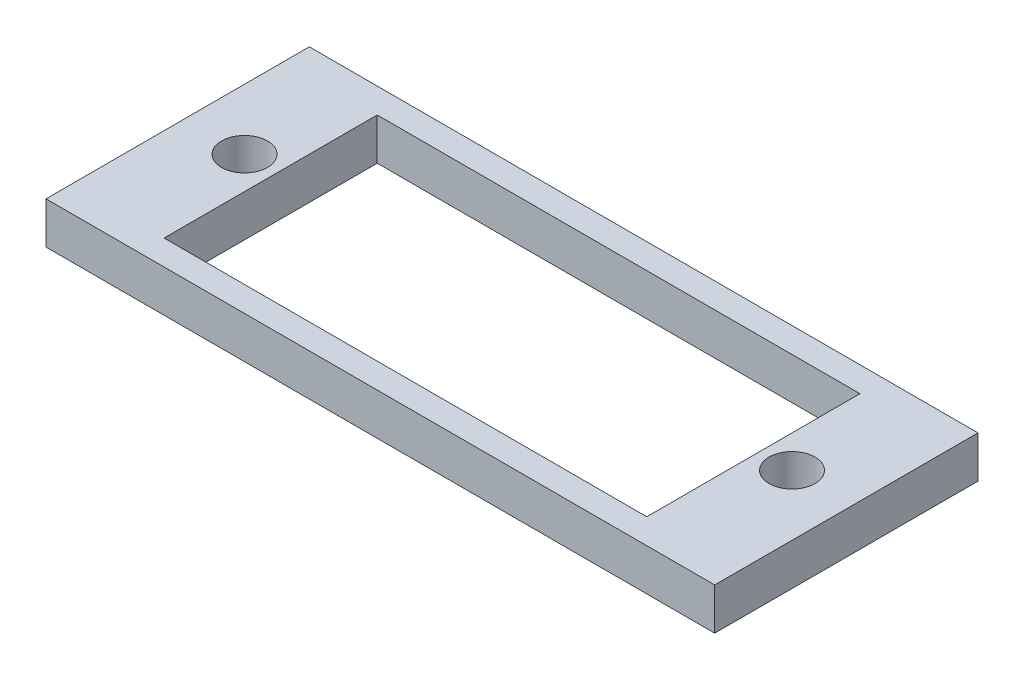
ISO-10303-21;
HEADER;
FILE_DESCRIPTION(('STEP AP214'),'2;1');
FILE_NAME('part.step','',(''),(''),'','','');
FILE_SCHEMA(('AUTOMOTIVE_DESIGN { 1 0 10303 214 1 1 1 1 }'));
ENDSEC;
DATA;
#1=APPLICATION_CONTEXT('core data for automotive mechanical design processes');
#2=APPLICATION_PROTOCOL_DEFINITION('international standard','automotive_design',2000,#1);
#3=PRODUCT_CONTEXT('',#1,'mechanical');
#4=PRODUCT('Part','Part','',(#3));
#5=PRODUCT_RELATED_PRODUCT_CATEGORY('part','',(#4));
#6=PRODUCT_DEFINITION_FORMATION('','',#4);
#7=PRODUCT_DEFINITION_CONTEXT('part definition',#1,'design');
#8=PRODUCT_DEFINITION('design','',#6,#7);
#9=PRODUCT_DEFINITION_SHAPE('','',#8);
#10=(LENGTH_UNIT() NAMED_UNIT(*) SI_UNIT(.MILLI.,.METRE.));
#11=(NAMED_UNIT(*) PLANE_ANGLE_UNIT() SI_UNIT($,.RADIAN.));
#12=(NAMED_UNIT(*) SI_UNIT($,.STERADIAN.) SOLID_ANGLE_UNIT());
#13=UNCERTAINTY_MEASURE_WITH_UNIT(LENGTH_MEASURE(1.E-05),#10,'distance_accuracy_value','');
#14=(GEOMETRIC_REPRESENTATION_CONTEXT(3) GLOBAL_UNCERTAINTY_ASSIGNED_CONTEXT((#13)) GLOBAL_UNIT_ASSIGNED_CONTEXT((#10,
#11,#12)) REPRESENTATION_CONTEXT('',''));
#15=CARTESIAN_POINT('',(0.,0.,0.));
#16=DIRECTION('',(0.,0.,1.));
#17=DIRECTION('',(1.,0.,0.));
#18=AXIS2_PLACEMENT_3D('',#15,#16,#17);
#19=CARTESIAN_POINT('',(0.,2.,0.));
#20=DIRECTION('',(0.,1.,0.));
#21=DIRECTION('',(0.,0.,1.));
#22=AXIS2_PLACEMENT_3D('',#19,#20,#21);
#23=PLANE('',#22);
#24=DIRECTION('',(1.,0.,0.));
#25=VECTOR('',#24,1.);
#26=CARTESIAN_POINT('',(4.45,2.,-1.2));
#27=LINE('',#26,#25);
#28=CARTESIAN_POINT('',(4.45,2.,-1.2));
#29=VERTEX_POINT('',#28);
#30=CARTESIAN_POINT('',(27.55,2.,-1.2));
#31=VERTEX_POINT('',#30);
#32=EDGE_CURVE('E118',#29,#31,#27,.T.);
#33=ORIENTED_EDGE('',*,*,#32,.F.);
#34=DIRECTION('',(0.,0.,1.));
#35=VECTOR('',#34,1.);
#36=CARTESIAN_POINT('',(4.45,2.,-11.4));
#37=LINE('',#36,#35);
#38=CARTESIAN_POINT('',(4.45,2.,-11.4));
#39=VERTEX_POINT('',#38);
#40=EDGE_CURVE('E109',#39,#29,#37,.T.);
#41=ORIENTED_EDGE('',*,*,#40,.F.);
#42=DIRECTION('',(-1.,0.,0.));
#43=VECTOR('',#42,1.);
#44=CARTESIAN_POINT('',(4.45,2.,-11.4));
#45=LINE('',#44,#43);
#46=CARTESIAN_POINT('',(27.55,2.,-11.4));
#47=VERTEX_POINT('',#46);
#48=EDGE_CURVE('E136',#47,#39,#45,.T.);
#49=ORIENTED_EDGE('',*,*,#48,.F.);
#50=DIRECTION('',(0.,0.,-1.));
#51=VECTOR('',#50,1.);
#52=CARTESIAN_POINT('',(27.55,2.,-11.4));
#53=LINE('',#52,#51);
#54=EDGE_CURVE('E132',#31,#47,#53,.T.);
#55=ORIENTED_EDGE('',*,*,#54,.F.);
#56=EDGE_LOOP('',(#33,#41,#49,#55));
#57=FACE_BOUND('',#56,.T.);
#58=CARTESIAN_POINT('',(29.1,2.,-6.6));
#59=DIRECTION('',(0.,1.,0.));
#60=DIRECTION('',(0.,0.,1.));
#61=AXIS2_PLACEMENT_3D('',#58,#59,#60);
#62=CIRCLE('',#61,1.1);
#63=CARTESIAN_POINT('',(29.1,2.,-5.5));
#64=VERTEX_POINT('',#63);
#65=EDGE_CURVE('E160',#64,#64,#62,.T.);
#66=ORIENTED_EDGE('',*,*,#65,.F.);
#67=EDGE_LOOP('',(#66));
#68=FACE_BOUND('',#67,.T.);
#69=DIRECTION('',(0.,0.,1.));
#70=VECTOR('',#69,1.);
#71=CARTESIAN_POINT('',(0.,2.,-12.6));
#72=LINE('',#71,#70);
#73=CARTESIAN_POINT('',(0.,2.,-12.6));
#74=VERTEX_POINT('',#73);
#75=CARTESIAN_POINT('',(0.,2.,0.));
#76=VERTEX_POINT('',#75);
#77=EDGE_CURVE('E168',#74,#76,#72,.T.);
#78=ORIENTED_EDGE('',*,*,#77,.T.);
#79=DIRECTION('',(1.,0.,0.));
#80=VECTOR('',#79,1.);
#81=CARTESIAN_POINT('',(0.,2.,0.));
#82=LINE('',#81,#80);
#83=CARTESIAN_POINT('',(32.,2.,0.));
#84=VERTEX_POINT('',#83);
#85=EDGE_CURVE('E172',#76,#84,#82,.T.);
#86=ORIENTED_EDGE('',*,*,#85,.T.);
#87=DIRECTION('',(0.,0.,-1.));
#88=VECTOR('',#87,1.);
#89=CARTESIAN_POINT('',(32.,2.,-12.6));
#90=LINE('',#89,#88);
#91=CARTESIAN_POINT('',(32.,2.,-12.6));
#92=VERTEX_POINT('',#91);
#93=EDGE_CURVE('E176',#84,#92,#90,.T.);
#94=ORIENTED_EDGE('',*,*,#93,.T.);
#95=DIRECTION('',(-1.,0.,0.));
#96=VECTOR('',#95,1.);
#97=CARTESIAN_POINT('',(0.,2.,-12.6));
#98=LINE('',#97,#96);
#99=EDGE_CURVE('E179',#92,#74,#98,.T.);
#100=ORIENTED_EDGE('',*,*,#99,.T.);
#101=EDGE_LOOP('',(#78,#86,#94,#100));
#102=FACE_BOUND('',#101,.T.);
#103=CARTESIAN_POINT('',(2.9,2.,-6.6));
#104=DIRECTION('',(0.,1.,0.));
#105=DIRECTION('',(0.,0.,1.));
#106=AXIS2_PLACEMENT_3D('',#103,#104,#105);
#107=CIRCLE('',#106,1.1);
#108=CARTESIAN_POINT('',(2.9,2.,-5.5));
#109=VERTEX_POINT('',#108);
#110=EDGE_CURVE('E144',#109,#109,#107,.T.);
#111=ORIENTED_EDGE('',*,*,#110,.F.);
#112=EDGE_LOOP('',(#111));
#113=FACE_BOUND('',#112,.T.);
#114=ADVANCED_FACE('F43',(#57,#68,#102,#113),#23,.T.);
#115=CARTESIAN_POINT('',(0.,0.,0.));
#116=DIRECTION('',(0.,1.,0.));
#117=DIRECTION('',(0.,0.,1.));
#118=AXIS2_PLACEMENT_3D('',#115,#116,#117);
#119=PLANE('',#118);
#120=CARTESIAN_POINT('',(29.1,0.,-6.6));
#121=DIRECTION('',(0.,1.,0.));
#122=DIRECTION('',(0.,0.,1.));
#123=AXIS2_PLACEMENT_3D('',#120,#121,#122);
#124=CIRCLE('',#123,1.1);
#125=CARTESIAN_POINT('',(29.1,0.,-5.5));
#126=VERTEX_POINT('',#125);
#127=EDGE_CURVE('E127',#126,#126,#124,.T.);
#128=ORIENTED_EDGE('',*,*,#127,.T.);
#129=EDGE_LOOP('',(#128));
#130=FACE_BOUND('',#129,.T.);
#131=DIRECTION('',(0.,0.,1.));
#132=VECTOR('',#131,1.);
#133=CARTESIAN_POINT('',(0.,0.,-12.6));
#134=LINE('',#133,#132);
#135=CARTESIAN_POINT('',(0.,0.,-12.6));
#136=VERTEX_POINT('',#135);
#137=CARTESIAN_POINT('',(0.,0.,0.));
#138=VERTEX_POINT('',#137);
#139=EDGE_CURVE('E164',#136,#138,#134,.T.);
#140=ORIENTED_EDGE('',*,*,#139,.F.);
#141=DIRECTION('',(-1.,0.,0.));
#142=VECTOR('',#141,1.);
#143=CARTESIAN_POINT('',(0.,0.,-12.6));
#144=LINE('',#143,#142);
#145=CARTESIAN_POINT('',(32.,0.,-12.6));
#146=VERTEX_POINT('',#145);
#147=EDGE_CURVE('E173',#146,#136,#144,.T.);
#148=ORIENTED_EDGE('',*,*,#147,.F.);
#149=DIRECTION('',(0.,0.,-1.));
#150=VECTOR('',#149,1.);
#151=CARTESIAN_POINT('',(32.,0.,-12.6));
#152=LINE('',#151,#150);
#153=CARTESIAN_POINT('',(32.,0.,0.));
#154=VERTEX_POINT('',#153);
#155=EDGE_CURVE('E189',#154,#146,#152,.T.);
#156=ORIENTED_EDGE('',*,*,#155,.F.);
#157=DIRECTION('',(1.,0.,0.));
#158=VECTOR('',#157,1.);
#159=CARTESIAN_POINT('',(0.,0.,0.));
#160=LINE('',#159,#158);
#161=EDGE_CURVE('E186',#138,#154,#160,.T.);
#162=ORIENTED_EDGE('',*,*,#161,.F.);
#163=EDGE_LOOP('',(#140,#148,#156,#162));
#164=FACE_BOUND('',#163,.T.);
#165=DIRECTION('',(0.,0.,1.));
#166=VECTOR('',#165,1.);
#167=CARTESIAN_POINT('',(4.45,0.,-11.4));
#168=LINE('',#167,#166);
#169=CARTESIAN_POINT('',(4.45,0.,-11.4));
#170=VERTEX_POINT('',#169);
#171=CARTESIAN_POINT('',(4.45,0.,-1.2));
#172=VERTEX_POINT('',#171);
#173=EDGE_CURVE('E67',#170,#172,#168,.T.);
#174=ORIENTED_EDGE('',*,*,#173,.T.);
#175=DIRECTION('',(1.,0.,0.));
#176=VECTOR('',#175,1.);
#177=CARTESIAN_POINT('',(4.45,0.,-1.2));
#178=LINE('',#177,#176);
#179=CARTESIAN_POINT('',(27.55,0.,-1.2));
#180=VERTEX_POINT('',#179);
#181=EDGE_CURVE('E125',#172,#180,#178,.T.);
#182=ORIENTED_EDGE('',*,*,#181,.T.);
#183=DIRECTION('',(0.,0.,-1.));
#184=VECTOR('',#183,1.);
#185=CARTESIAN_POINT('',(27.55,0.,-11.4));
#186=LINE('',#185,#184);
#187=CARTESIAN_POINT('',(27.55,0.,-11.4));
#188=VERTEX_POINT('',#187);
#189=EDGE_CURVE('E147',#180,#188,#186,.T.);
#190=ORIENTED_EDGE('',*,*,#189,.T.);
#191=DIRECTION('',(-1.,0.,0.));
#192=VECTOR('',#191,1.);
#193=CARTESIAN_POINT('',(4.45,0.,-11.4));
#194=LINE('',#193,#192);
#195=EDGE_CURVE('E119',#188,#170,#194,.T.);
#196=ORIENTED_EDGE('',*,*,#195,.T.);
#197=EDGE_LOOP('',(#174,#182,#190,#196));
#198=FACE_BOUND('',#197,.T.);
#199=CARTESIAN_POINT('',(2.9,0.,-6.6));
#200=DIRECTION('',(0.,1.,0.));
#201=DIRECTION('',(0.,0.,1.));
#202=AXIS2_PLACEMENT_3D('',#199,#200,#201);
#203=CIRCLE('',#202,1.1);
#204=CARTESIAN_POINT('',(2.9,0.,-5.5));
#205=VERTEX_POINT('',#204);
#206=EDGE_CURVE('E274',#205,#205,#203,.T.);
#207=ORIENTED_EDGE('',*,*,#206,.T.);
#208=EDGE_LOOP('',(#207));
#209=FACE_BOUND('',#208,.T.);
#210=ADVANCED_FACE('F212',(#130,#164,#198,#209),#119,.F.);
#211=CARTESIAN_POINT('',(0.,2.,-12.6));
#212=DIRECTION('',(1.,0.,0.));
#213=DIRECTION('',(0.,0.,-1.));
#214=AXIS2_PLACEMENT_3D('',#211,#212,#213);
#215=PLANE('',#214);
#216=ORIENTED_EDGE('',*,*,#139,.T.);
#217=DIRECTION('',(0.,-1.,0.));
#218=VECTOR('',#217,1.);
#219=CARTESIAN_POINT('',(0.,2.,0.));
#220=LINE('',#219,#218);
#221=EDGE_CURVE('E11',#76,#138,#220,.T.);
#222=ORIENTED_EDGE('',*,*,#221,.F.);
#223=ORIENTED_EDGE('',*,*,#77,.F.);
#224=DIRECTION('',(0.,-1.,0.));
#225=VECTOR('',#224,1.);
#226=CARTESIAN_POINT('',(0.,2.,-12.6));
#227=LINE('',#226,#225);
#228=EDGE_CURVE('E182',#74,#136,#227,.T.);
#229=ORIENTED_EDGE('',*,*,#228,.T.);
#230=EDGE_LOOP('',(#216,#222,#223,#229));
#231=FACE_BOUND('',#230,.T.);
#232=ADVANCED_FACE('F45',(#231),#215,.F.);
#233=CARTESIAN_POINT('',(0.,2.,0.));
#234=DIRECTION('',(0.,0.,-1.));
#235=DIRECTION('',(-1.,0.,0.));
#236=AXIS2_PLACEMENT_3D('',#233,#234,#235);
#237=PLANE('',#236);
#238=ORIENTED_EDGE('',*,*,#161,.T.);
#239=DIRECTION('',(0.,-1.,0.));
#240=VECTOR('',#239,1.);
#241=CARTESIAN_POINT('',(32.,2.,0.));
#242=LINE('',#241,#240);
#243=EDGE_CURVE('E52',#84,#154,#242,.T.);
#244=ORIENTED_EDGE('',*,*,#243,.F.);
#245=ORIENTED_EDGE('',*,*,#85,.F.);
#246=ORIENTED_EDGE('',*,*,#221,.T.);
#247=EDGE_LOOP('',(#238,#244,#245,#246));
#248=FACE_BOUND('',#247,.T.);
#249=ADVANCED_FACE('F223',(#248),#237,.F.);
#250=CARTESIAN_POINT('',(32.,2.,-12.6));
#251=DIRECTION('',(-1.,0.,0.));
#252=DIRECTION('',(0.,0.,1.));
#253=AXIS2_PLACEMENT_3D('',#250,#251,#252);
#254=PLANE('',#253);
#255=ORIENTED_EDGE('',*,*,#155,.T.);
#256=DIRECTION('',(0.,-1.,0.));
#257=VECTOR('',#256,1.);
#258=CARTESIAN_POINT('',(32.,2.,-12.6));
#259=LINE('',#258,#257);
#260=EDGE_CURVE('E197',#92,#146,#259,.T.);
#261=ORIENTED_EDGE('',*,*,#260,.F.);
#262=ORIENTED_EDGE('',*,*,#93,.F.);
#263=ORIENTED_EDGE('',*,*,#243,.T.);
#264=EDGE_LOOP('',(#255,#261,#262,#263));
#265=FACE_BOUND('',#264,.T.);
#266=ADVANCED_FACE('F206',(#265),#254,.F.);
#267=CARTESIAN_POINT('',(0.,2.,-12.6));
#268=DIRECTION('',(0.,0.,1.));
#269=DIRECTION('',(1.,0.,0.));
#270=AXIS2_PLACEMENT_3D('',#267,#268,#269);
#271=PLANE('',#270);
#272=ORIENTED_EDGE('',*,*,#147,.T.);
#273=ORIENTED_EDGE('',*,*,#228,.F.);
#274=ORIENTED_EDGE('',*,*,#99,.F.);
#275=ORIENTED_EDGE('',*,*,#260,.T.);
#276=EDGE_LOOP('',(#272,#273,#274,#275));
#277=FACE_BOUND('',#276,.T.);
#278=ADVANCED_FACE('F216',(#277),#271,.F.);
#279=CARTESIAN_POINT('',(29.1,2.,-6.6));
#280=DIRECTION('',(0.,-1.,0.));
#281=DIRECTION('',(0.,0.,-1.));
#282=AXIS2_PLACEMENT_3D('',#279,#280,#281);
#283=CYLINDRICAL_SURFACE('',#282,1.1);
#284=ORIENTED_EDGE('',*,*,#65,.T.);
#285=EDGE_LOOP('',(#284));
#286=FACE_BOUND('',#285,.T.);
#287=ORIENTED_EDGE('',*,*,#127,.F.);
#288=EDGE_LOOP('',(#287));
#289=FACE_BOUND('',#288,.T.);
#290=ADVANCED_FACE('F238',(#286,#289),#283,.F.);
#291=CARTESIAN_POINT('',(4.45,2.,-11.4));
#292=DIRECTION('',(1.,0.,0.));
#293=DIRECTION('',(0.,0.,-1.));
#294=AXIS2_PLACEMENT_3D('',#291,#292,#293);
#295=PLANE('',#294);
#296=ORIENTED_EDGE('',*,*,#173,.F.);
#297=DIRECTION('',(0.,-1.,0.));
#298=VECTOR('',#297,1.);
#299=CARTESIAN_POINT('',(4.45,2.,-11.4));
#300=LINE('',#299,#298);
#301=EDGE_CURVE('E113',#39,#170,#300,.T.);
#302=ORIENTED_EDGE('',*,*,#301,.F.);
#303=ORIENTED_EDGE('',*,*,#40,.T.);
#304=DIRECTION('',(0.,-1.,0.));
#305=VECTOR('',#304,1.);
#306=CARTESIAN_POINT('',(4.45,2.,-1.2));
#307=LINE('',#306,#305);
#308=EDGE_CURVE('E112',#29,#172,#307,.T.);
#309=ORIENTED_EDGE('',*,*,#308,.T.);
#310=EDGE_LOOP('',(#296,#302,#303,#309));
#311=FACE_BOUND('',#310,.T.);
#312=ADVANCED_FACE('F111',(#311),#295,.T.);
#313=CARTESIAN_POINT('',(4.45,2.,-1.2));
#314=DIRECTION('',(0.,0.,-1.));
#315=DIRECTION('',(-1.,0.,0.));
#316=AXIS2_PLACEMENT_3D('',#313,#314,#315);
#317=PLANE('',#316);
#318=ORIENTED_EDGE('',*,*,#181,.F.);
#319=ORIENTED_EDGE('',*,*,#308,.F.);
#320=ORIENTED_EDGE('',*,*,#32,.T.);
#321=DIRECTION('',(0.,-1.,0.));
#322=VECTOR('',#321,1.);
#323=CARTESIAN_POINT('',(27.55,2.,-1.2));
#324=LINE('',#323,#322);
#325=EDGE_CURVE('E128',#31,#180,#324,.T.);
#326=ORIENTED_EDGE('',*,*,#325,.T.);
#327=EDGE_LOOP('',(#318,#319,#320,#326));
#328=FACE_BOUND('',#327,.T.);
#329=ADVANCED_FACE('F122',(#328),#317,.T.);
#330=CARTESIAN_POINT('',(27.55,2.,-11.4));
#331=DIRECTION('',(-1.,0.,0.));
#332=DIRECTION('',(0.,0.,1.));
#333=AXIS2_PLACEMENT_3D('',#330,#331,#332);
#334=PLANE('',#333);
#335=ORIENTED_EDGE('',*,*,#189,.F.);
#336=ORIENTED_EDGE('',*,*,#325,.F.);
#337=ORIENTED_EDGE('',*,*,#54,.T.);
#338=DIRECTION('',(0.,-1.,0.));
#339=VECTOR('',#338,1.);
#340=CARTESIAN_POINT('',(27.55,2.,-11.4));
#341=LINE('',#340,#339);
#342=EDGE_CURVE('E59',#47,#188,#341,.T.);
#343=ORIENTED_EDGE('',*,*,#342,.T.);
#344=EDGE_LOOP('',(#335,#336,#337,#343));
#345=FACE_BOUND('',#344,.T.);
#346=ADVANCED_FACE('F255',(#345),#334,.T.);
#347=CARTESIAN_POINT('',(4.45,2.,-11.4));
#348=DIRECTION('',(0.,0.,1.));
#349=DIRECTION('',(1.,0.,0.));
#350=AXIS2_PLACEMENT_3D('',#347,#348,#349);
#351=PLANE('',#350);
#352=ORIENTED_EDGE('',*,*,#195,.F.);
#353=ORIENTED_EDGE('',*,*,#342,.F.);
#354=ORIENTED_EDGE('',*,*,#48,.T.);
#355=ORIENTED_EDGE('',*,*,#301,.T.);
#356=EDGE_LOOP('',(#352,#353,#354,#355));
#357=FACE_BOUND('',#356,.T.);
#358=ADVANCED_FACE('F260',(#357),#351,.T.);
#359=CARTESIAN_POINT('',(2.9,2.,-6.6));
#360=DIRECTION('',(0.,-1.,0.));
#361=DIRECTION('',(0.,0.,-1.));
#362=AXIS2_PLACEMENT_3D('',#359,#360,#361);
#363=CYLINDRICAL_SURFACE('',#362,1.1);
#364=ORIENTED_EDGE('',*,*,#110,.T.);
#365=EDGE_LOOP('',(#364));
#366=FACE_BOUND('',#365,.T.);
#367=ORIENTED_EDGE('',*,*,#206,.F.);
#368=EDGE_LOOP('',(#367));
#369=FACE_BOUND('',#368,.T.);
#370=ADVANCED_FACE('F264',(#366,#369),#363,.F.);
#371=CLOSED_SHELL('',(#114,#210,#232,#249,#266,#278,#290,#312,#329,#346,#358,#370));
#372=MANIFOLD_SOLID_BREP('B2',#371);
#373=ADVANCED_BREP_SHAPE_REPRESENTATION('',(#18,#372),#14);
#374=SHAPE_DEFINITION_REPRESENTATION(#9,#373);
ENDSEC;
END-ISO-10303-21;
